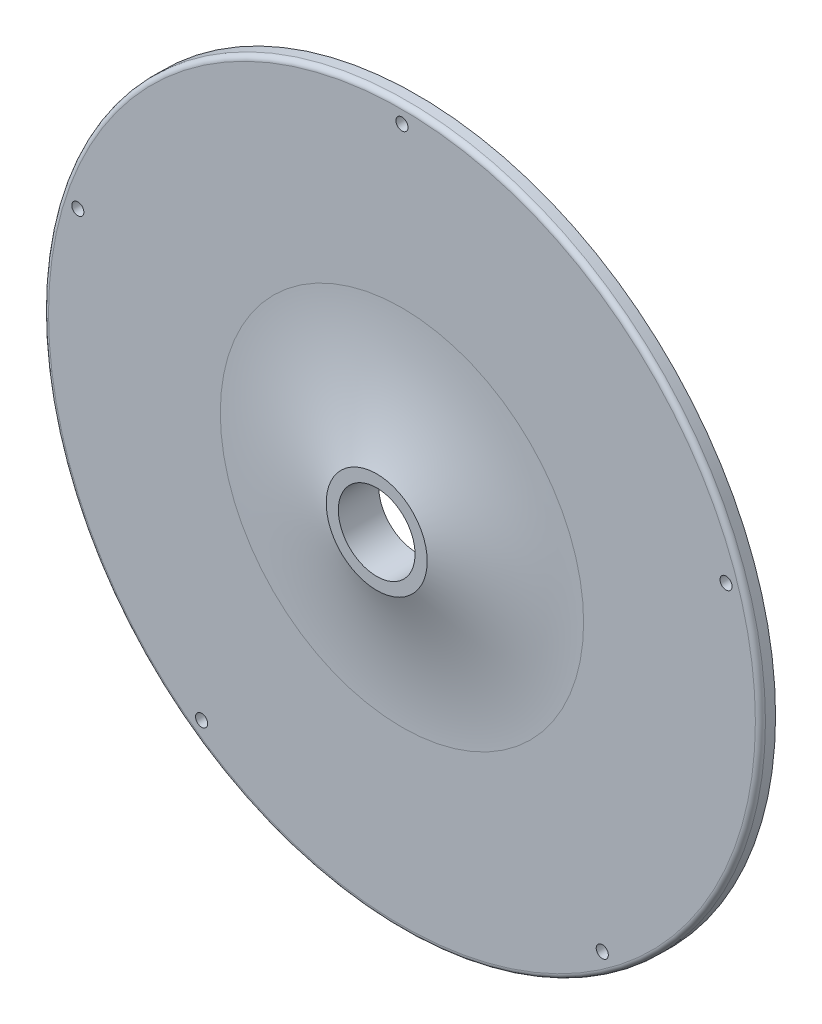
ISO-10303-21;
HEADER;
FILE_DESCRIPTION(('STEP AP214'),'2;1');
FILE_NAME('part.step','',(''),(''),'','','');
FILE_SCHEMA(('AUTOMOTIVE_DESIGN { 1 0 10303 214 1 1 1 1 }'));
ENDSEC;
DATA;
#1=APPLICATION_CONTEXT('core data for automotive mechanical design processes');
#2=APPLICATION_PROTOCOL_DEFINITION('international standard','automotive_design',2000,#1);
#3=PRODUCT_CONTEXT('',#1,'mechanical');
#4=PRODUCT('Part','Part','',(#3));
#5=PRODUCT_RELATED_PRODUCT_CATEGORY('part','',(#4));
#6=PRODUCT_DEFINITION_FORMATION('','',#4);
#7=PRODUCT_DEFINITION_CONTEXT('part definition',#1,'design');
#8=PRODUCT_DEFINITION('design','',#6,#7);
#9=PRODUCT_DEFINITION_SHAPE('','',#8);
#10=(LENGTH_UNIT() NAMED_UNIT(*) SI_UNIT(.MILLI.,.METRE.));
#11=(NAMED_UNIT(*) PLANE_ANGLE_UNIT() SI_UNIT($,.RADIAN.));
#12=(NAMED_UNIT(*) SI_UNIT($,.STERADIAN.) SOLID_ANGLE_UNIT());
#13=UNCERTAINTY_MEASURE_WITH_UNIT(LENGTH_MEASURE(1.E-05),#10,'distance_accuracy_value','');
#14=(GEOMETRIC_REPRESENTATION_CONTEXT(3) GLOBAL_UNCERTAINTY_ASSIGNED_CONTEXT((#13)) GLOBAL_UNIT_ASSIGNED_CONTEXT((#10,
#11,#12)) REPRESENTATION_CONTEXT('',''));
#15=CARTESIAN_POINT('',(0.,0.,0.));
#16=DIRECTION('',(0.,0.,1.));
#17=DIRECTION('',(1.,0.,0.));
#18=AXIS2_PLACEMENT_3D('',#15,#16,#17);
#19=CARTESIAN_POINT('',(0.,0.,-1.27));
#20=DIRECTION('',(0.,0.,1.));
#21=DIRECTION('',(1.,0.,0.));
#22=AXIS2_PLACEMENT_3D('',#19,#20,#21);
#23=CYLINDRICAL_SURFACE('',#22,81.28);
#24=CARTESIAN_POINT('',(0.,0.,-1.27));
#25=DIRECTION('',(0.,0.,1.));
#26=DIRECTION('',(1.,0.,0.));
#27=AXIS2_PLACEMENT_3D('',#24,#25,#26);
#28=CIRCLE('',#27,81.28);
#29=CARTESIAN_POINT('',(81.28,0.,-1.27));
#30=VERTEX_POINT('',#29);
#31=EDGE_CURVE('E49',#30,#30,#28,.T.);
#32=ORIENTED_EDGE('',*,*,#31,.T.);
#33=EDGE_LOOP('',(#32));
#34=FACE_BOUND('',#33,.T.);
#35=CARTESIAN_POINT('',(0.,0.,0.));
#36=DIRECTION('',(0.,0.,1.));
#37=DIRECTION('',(1.,0.,0.));
#38=AXIS2_PLACEMENT_3D('',#35,#36,#37);
#39=CIRCLE('',#38,81.28);
#40=CARTESIAN_POINT('',(81.28,0.,0.));
#41=VERTEX_POINT('',#40);
#42=EDGE_CURVE('E52',#41,#41,#39,.T.);
#43=ORIENTED_EDGE('',*,*,#42,.F.);
#44=EDGE_LOOP('',(#43));
#45=FACE_BOUND('',#44,.T.);
#46=ADVANCED_FACE('F34',(#34,#45),#23,.T.);
#47=CARTESIAN_POINT('',(0.,0.,-1.27));
#48=DIRECTION('',(0.,0.,1.));
#49=DIRECTION('',(1.,0.,0.));
#50=AXIS2_PLACEMENT_3D('',#47,#48,#49);
#51=PLANE('',#50);
#52=CARTESIAN_POINT('',(0.,0.,-1.27));
#53=DIRECTION('',(0.,0.,-1.));
#54=DIRECTION('',(-1.,0.,0.));
#55=AXIS2_PLACEMENT_3D('',#52,#53,#54);
#56=CIRCLE('',#55,13.97);
#57=CARTESIAN_POINT('',(-13.97,0.,-1.27));
#58=VERTEX_POINT('',#57);
#59=EDGE_CURVE('E94',#58,#58,#56,.T.);
#60=ORIENTED_EDGE('',*,*,#59,.F.);
#61=EDGE_LOOP('',(#60));
#62=FACE_BOUND('',#61,.T.);
#63=ORIENTED_EDGE('',*,*,#31,.F.);
#64=EDGE_LOOP('',(#63));
#65=FACE_BOUND('',#64,.T.);
#66=ADVANCED_FACE('F128',(#62,#65),#51,.F.);
#67=CARTESIAN_POINT('',(0.,0.,3.81));
#68=DIRECTION('',(0.,0.,-1.));
#69=DIRECTION('',(-1.,0.,0.));
#70=AXIS2_PLACEMENT_3D('',#67,#68,#69);
#71=CYLINDRICAL_SURFACE('',#70,90.17);
#72=CARTESIAN_POINT('',(0.,0.,2.54));
#73=DIRECTION('',(0.,0.,1.));
#74=DIRECTION('',(1.,0.,0.));
#75=AXIS2_PLACEMENT_3D('',#72,#73,#74);
#76=CIRCLE('',#75,90.17);
#77=CARTESIAN_POINT('',(-90.17,0.,2.54));
#78=VERTEX_POINT('',#77);
#79=EDGE_CURVE('E10',#78,#78,#76,.F.);
#80=CARTESIAN_POINT('',(0.,0.,0.));
#81=DIRECTION('',(0.,0.,1.));
#82=DIRECTION('',(1.,0.,0.));
#83=AXIS2_PLACEMENT_3D('',#80,#81,#82);
#84=CIRCLE('',#83,90.17);
#85=CARTESIAN_POINT('',(-90.17,0.,0.));
#86=VERTEX_POINT('',#85);
#87=EDGE_CURVE('E55',#86,#86,#84,.T.);
#88=CARTESIAN_POINT('',(-90.17,0.,2.54));
#89=CARTESIAN_POINT('',(-90.17,0.,2.51354166666667));
#90=CARTESIAN_POINT('',(-90.17,0.,2.48708333333333));
#91=CARTESIAN_POINT('',(-90.17,0.,2.43416666666667));
#92=CARTESIAN_POINT('',(-90.17,0.,2.40770833333333));
#93=CARTESIAN_POINT('',(-90.17,0.,2.35479166666667));
#94=CARTESIAN_POINT('',(-90.17,0.,2.32833333333333));
#95=CARTESIAN_POINT('',(-90.17,0.,2.27541666666667));
#96=CARTESIAN_POINT('',(-90.17,0.,2.24895833333333));
#97=CARTESIAN_POINT('',(-90.17,0.,2.19604166666667));
#98=CARTESIAN_POINT('',(-90.17,0.,2.16958333333333));
#99=CARTESIAN_POINT('',(-90.17,0.,2.11666666666667));
#100=CARTESIAN_POINT('',(-90.17,0.,2.09020833333333));
#101=CARTESIAN_POINT('',(-90.17,0.,2.03729166666667));
#102=CARTESIAN_POINT('',(-90.17,0.,2.01083333333333));
#103=CARTESIAN_POINT('',(-90.17,0.,1.95791666666667));
#104=CARTESIAN_POINT('',(-90.17,0.,1.93145833333333));
#105=CARTESIAN_POINT('',(-90.17,0.,1.87854166666667));
#106=CARTESIAN_POINT('',(-90.17,0.,1.85208333333333));
#107=CARTESIAN_POINT('',(-90.17,0.,1.79916666666667));
#108=CARTESIAN_POINT('',(-90.17,0.,1.77270833333333));
#109=CARTESIAN_POINT('',(-90.17,0.,1.71979166666667));
#110=CARTESIAN_POINT('',(-90.17,0.,1.69333333333333));
#111=CARTESIAN_POINT('',(-90.17,0.,1.64041666666667));
#112=CARTESIAN_POINT('',(-90.17,0.,1.61395833333333));
#113=CARTESIAN_POINT('',(-90.17,0.,1.56104166666667));
#114=CARTESIAN_POINT('',(-90.17,0.,1.53458333333333));
#115=CARTESIAN_POINT('',(-90.17,0.,1.48166666666667));
#116=CARTESIAN_POINT('',(-90.17,0.,1.45520833333333));
#117=CARTESIAN_POINT('',(-90.17,0.,1.40229166666667));
#118=CARTESIAN_POINT('',(-90.17,0.,1.37583333333333));
#119=CARTESIAN_POINT('',(-90.17,0.,1.32291666666667));
#120=CARTESIAN_POINT('',(-90.17,0.,1.29645833333333));
#121=CARTESIAN_POINT('',(-90.17,0.,1.24354166666667));
#122=CARTESIAN_POINT('',(-90.17,0.,1.21708333333333));
#123=CARTESIAN_POINT('',(-90.17,0.,1.16416666666667));
#124=CARTESIAN_POINT('',(-90.17,0.,1.13770833333333));
#125=CARTESIAN_POINT('',(-90.17,0.,1.08479166666667));
#126=CARTESIAN_POINT('',(-90.17,0.,1.05833333333333));
#127=CARTESIAN_POINT('',(-90.17,0.,1.00541666666667));
#128=CARTESIAN_POINT('',(-90.17,0.,0.978958333333333));
#129=CARTESIAN_POINT('',(-90.17,0.,0.926041666666666));
#130=CARTESIAN_POINT('',(-90.17,0.,0.899583333333333));
#131=CARTESIAN_POINT('',(-90.17,0.,0.846666666666667));
#132=CARTESIAN_POINT('',(-90.17,0.,0.820208333333333));
#133=CARTESIAN_POINT('',(-90.17,0.,0.767291666666667));
#134=CARTESIAN_POINT('',(-90.17,0.,0.740833333333333));
#135=CARTESIAN_POINT('',(-90.17,0.,0.687916666666667));
#136=CARTESIAN_POINT('',(-90.17,0.,0.661458333333333));
#137=CARTESIAN_POINT('',(-90.17,0.,0.608541666666667));
#138=CARTESIAN_POINT('',(-90.17,0.,0.582083333333333));
#139=CARTESIAN_POINT('',(-90.17,0.,0.529166666666667));
#140=CARTESIAN_POINT('',(-90.17,0.,0.502708333333333));
#141=CARTESIAN_POINT('',(-90.17,0.,0.449791666666667));
#142=CARTESIAN_POINT('',(-90.17,0.,0.423333333333333));
#143=CARTESIAN_POINT('',(-90.17,0.,0.370416666666667));
#144=CARTESIAN_POINT('',(-90.17,0.,0.343958333333333));
#145=CARTESIAN_POINT('',(-90.17,0.,0.291041666666667));
#146=CARTESIAN_POINT('',(-90.17,0.,0.264583333333333));
#147=CARTESIAN_POINT('',(-90.17,0.,0.211666666666667));
#148=CARTESIAN_POINT('',(-90.17,0.,0.185208333333333));
#149=CARTESIAN_POINT('',(-90.17,0.,0.132291666666667));
#150=CARTESIAN_POINT('',(-90.17,0.,0.105833333333333));
#151=CARTESIAN_POINT('',(-90.17,0.,0.0529166666666667));
#152=CARTESIAN_POINT('',(-90.17,0.,0.0264583333333333));
#153=CARTESIAN_POINT('',(-90.17,0.,0.));
#154=B_SPLINE_CURVE_WITH_KNOTS('',3,(#88,#89,#90,#91,#92,#93,#94,#95,#96,#97,#98,#99,#100,#101,
#102,#103,#104,#105,#106,#107,#108,#109,#110,#111,#112,#113,#114,#115,#116,#117,#118,#119,#120,
#121,#122,#123,#124,#125,#126,#127,#128,#129,#130,#131,#132,#133,#134,#135,#136,#137,#138,#139,
#140,#141,#142,#143,#144,#145,#146,#147,#148,#149,#150,#151,#152,#153),.UNSPECIFIED.,.F.,.F.,(4,
2,2,2,2,2,2,2,2,2,2,2,2,2,2,2,2,2,2,2,2,2,2,2,2,2,2,2,2,2,2,2,4),(0.,0.0793750000000004,0.15875,
0.238125,0.3175,0.396875000000001,0.47625,0.555625,0.635,0.714375,0.79375,0.873125,0.9525,
1.031875,1.11125,1.190625,1.27,1.349375,1.42875,1.508125,1.5875,1.666875,1.74625,1.825625,1.905,
1.984375,2.06375,2.143125,2.2225,2.301875,2.38125,2.460625,2.54),.UNSPECIFIED.);
#155=EDGE_CURVE('BSEAM131',#78,#86,#154,.T.);
#156=ORIENTED_EDGE('',*,*,#79,.T.);
#157=ORIENTED_EDGE('',*,*,#87,.T.);
#158=ORIENTED_EDGE('',*,*,#155,.T.);
#159=ORIENTED_EDGE('',*,*,#155,.F.);
#160=EDGE_LOOP('',(#156,#158,#157,#159));
#161=FACE_BOUND('',#160,.T.);
#162=ADVANCED_FACE('F131',(#161),#71,.T.);
#163=CARTESIAN_POINT('',(0.,0.,3.81));
#164=DIRECTION('',(0.,0.,1.));
#165=DIRECTION('',(1.,0.,0.));
#166=AXIS2_PLACEMENT_3D('',#163,#164,#165);
#167=PLANE('',#166);
#168=CARTESIAN_POINT('',(0.,0.,3.81));
#169=DIRECTION('',(0.,0.,1.));
#170=DIRECTION('',(1.,0.,0.));
#171=AXIS2_PLACEMENT_3D('',#168,#169,#170);
#172=CIRCLE('',#171,88.9);
#173=CARTESIAN_POINT('',(88.9,0.,3.81));
#174=VERTEX_POINT('',#173);
#175=EDGE_CURVE('E41',#174,#174,#172,.T.);
#176=ORIENTED_EDGE('',*,*,#175,.T.);
#177=EDGE_LOOP('',(#176));
#178=FACE_BOUND('',#177,.T.);
#179=CARTESIAN_POINT('',(0.,0.,3.80999999999999));
#180=DIRECTION('',(0.,0.,1.));
#181=DIRECTION('',(1.,0.,0.));
#182=AXIS2_PLACEMENT_3D('',#179,#180,#181);
#183=CIRCLE('',#182,45.6955678841871);
#184=CARTESIAN_POINT('',(45.6955678841871,0.,3.80999999999999));
#185=VERTEX_POINT('',#184);
#186=EDGE_CURVE('E45',#185,#185,#183,.F.);
#187=ORIENTED_EDGE('',*,*,#186,.T.);
#188=EDGE_LOOP('',(#187));
#189=FACE_BOUND('',#188,.T.);
#190=CARTESIAN_POINT('',(-81.5293198594021,26.4904818427921,3.81));
#191=DIRECTION('',(0.,0.,1.));
#192=DIRECTION('',(0.309016994374945,0.951056516295155,0.));
#193=AXIS2_PLACEMENT_3D('',#190,#191,#192);
#194=CIRCLE('',#193,1.524);
#195=CARTESIAN_POINT('',(-83.0533198594021,26.4904818427921,3.81));
#196=VERTEX_POINT('',#195);
#197=EDGE_CURVE('E64',#196,#196,#194,.T.);
#198=ORIENTED_EDGE('',*,*,#197,.F.);
#199=EDGE_LOOP('',(#198));
#200=FACE_BOUND('',#199,.T.);
#201=CARTESIAN_POINT('',(-50.3878907527719,-69.3529818427926,3.81));
#202=DIRECTION('',(0.,0.,1.));
#203=DIRECTION('',(-0.809016994374951,0.587785252292469,0.));
#204=AXIS2_PLACEMENT_3D('',#201,#202,#203);
#205=CIRCLE('',#204,1.524);
#206=CARTESIAN_POINT('',(-51.9118907527719,-69.3529818427926,3.81));
#207=VERTEX_POINT('',#206);
#208=EDGE_CURVE('E83',#207,#207,#205,.T.);
#209=ORIENTED_EDGE('',*,*,#208,.F.);
#210=EDGE_LOOP('',(#209));
#211=FACE_BOUND('',#210,.T.);
#212=CARTESIAN_POINT('',(50.3878907527729,-69.3529818427919,3.81));
#213=DIRECTION('',(0.,0.,1.));
#214=DIRECTION('',(-0.809016994374942,-0.58778525229248,0.));
#215=AXIS2_PLACEMENT_3D('',#212,#213,#214);
#216=CIRCLE('',#215,1.524);
#217=CARTESIAN_POINT('',(48.8638907527729,-69.3529818427919,3.81));
#218=VERTEX_POINT('',#217);
#219=EDGE_CURVE('E77',#218,#218,#216,.T.);
#220=ORIENTED_EDGE('',*,*,#219,.F.);
#221=EDGE_LOOP('',(#220));
#222=FACE_BOUND('',#221,.T.);
#223=CARTESIAN_POINT('',(81.5293198594017,26.4904818427933,3.81));
#224=DIRECTION('',(0.,0.,1.));
#225=DIRECTION('',(0.309016994374958,-0.95105651629515,0.));
#226=AXIS2_PLACEMENT_3D('',#223,#224,#225);
#227=CIRCLE('',#226,1.524);
#228=CARTESIAN_POINT('',(80.0053198594017,26.4904818427933,3.81));
#229=VERTEX_POINT('',#228);
#230=EDGE_CURVE('E70',#229,#229,#227,.T.);
#231=ORIENTED_EDGE('',*,*,#230,.F.);
#232=EDGE_LOOP('',(#231));
#233=FACE_BOUND('',#232,.T.);
#234=CARTESIAN_POINT('',(0.,85.725,3.81));
#235=DIRECTION('',(0.,0.,1.));
#236=DIRECTION('',(1.,0.,0.));
#237=AXIS2_PLACEMENT_3D('',#234,#235,#236);
#238=CIRCLE('',#237,1.524);
#239=CARTESIAN_POINT('',(-1.524,85.725,3.81));
#240=VERTEX_POINT('',#239);
#241=EDGE_CURVE('E60',#240,#240,#238,.T.);
#242=ORIENTED_EDGE('',*,*,#241,.F.);
#243=EDGE_LOOP('',(#242));
#244=FACE_BOUND('',#243,.T.);
#245=ADVANCED_FACE('F144',(#178,#189,#200,#211,#222,#233,#244),#167,.T.);
#246=CARTESIAN_POINT('',(0.,0.,0.));
#247=DIRECTION('',(0.,0.,1.));
#248=DIRECTION('',(1.,0.,0.));
#249=AXIS2_PLACEMENT_3D('',#246,#247,#248);
#250=PLANE('',#249);
#251=CARTESIAN_POINT('',(-81.5293198594021,26.4904818427921,0.));
#252=DIRECTION('',(0.,0.,1.));
#253=DIRECTION('',(0.309016994374945,0.951056516295155,0.));
#254=AXIS2_PLACEMENT_3D('',#251,#252,#253);
#255=CIRCLE('',#254,1.524);
#256=CARTESIAN_POINT('',(-83.0533198594021,26.4904818427921,0.));
#257=VERTEX_POINT('',#256);
#258=EDGE_CURVE('E86',#257,#257,#255,.T.);
#259=ORIENTED_EDGE('',*,*,#258,.T.);
#260=EDGE_LOOP('',(#259));
#261=FACE_BOUND('',#260,.T.);
#262=CARTESIAN_POINT('',(-50.3878907527719,-69.3529818427926,0.));
#263=DIRECTION('',(0.,0.,1.));
#264=DIRECTION('',(-0.809016994374951,0.587785252292469,0.));
#265=AXIS2_PLACEMENT_3D('',#262,#263,#264);
#266=CIRCLE('',#265,1.524);
#267=CARTESIAN_POINT('',(-51.9118907527719,-69.3529818427926,0.));
#268=VERTEX_POINT('',#267);
#269=EDGE_CURVE('E80',#268,#268,#266,.T.);
#270=ORIENTED_EDGE('',*,*,#269,.T.);
#271=EDGE_LOOP('',(#270));
#272=FACE_BOUND('',#271,.T.);
#273=CARTESIAN_POINT('',(50.3878907527729,-69.3529818427919,0.));
#274=DIRECTION('',(0.,0.,1.));
#275=DIRECTION('',(-0.809016994374942,-0.58778525229248,0.));
#276=AXIS2_PLACEMENT_3D('',#273,#274,#275);
#277=CIRCLE('',#276,1.524);
#278=CARTESIAN_POINT('',(48.8638907527729,-69.3529818427919,0.));
#279=VERTEX_POINT('',#278);
#280=EDGE_CURVE('E74',#279,#279,#277,.T.);
#281=ORIENTED_EDGE('',*,*,#280,.T.);
#282=EDGE_LOOP('',(#281));
#283=FACE_BOUND('',#282,.T.);
#284=CARTESIAN_POINT('',(81.5293198594017,26.4904818427933,0.));
#285=DIRECTION('',(0.,0.,1.));
#286=DIRECTION('',(0.309016994374958,-0.95105651629515,0.));
#287=AXIS2_PLACEMENT_3D('',#284,#285,#286);
#288=CIRCLE('',#287,1.524);
#289=CARTESIAN_POINT('',(80.0053198594017,26.4904818427933,0.));
#290=VERTEX_POINT('',#289);
#291=EDGE_CURVE('E67',#290,#290,#288,.T.);
#292=ORIENTED_EDGE('',*,*,#291,.T.);
#293=EDGE_LOOP('',(#292));
#294=FACE_BOUND('',#293,.T.);
#295=CARTESIAN_POINT('',(0.,85.725,0.));
#296=DIRECTION('',(0.,0.,1.));
#297=DIRECTION('',(1.,0.,0.));
#298=AXIS2_PLACEMENT_3D('',#295,#296,#297);
#299=CIRCLE('',#298,1.524);
#300=CARTESIAN_POINT('',(-1.524,85.725,0.));
#301=VERTEX_POINT('',#300);
#302=EDGE_CURVE('E61',#301,#301,#299,.T.);
#303=ORIENTED_EDGE('',*,*,#302,.T.);
#304=EDGE_LOOP('',(#303));
#305=FACE_BOUND('',#304,.T.);
#306=ORIENTED_EDGE('',*,*,#42,.T.);
#307=EDGE_LOOP('',(#306));
#308=FACE_BOUND('',#307,.T.);
#309=ORIENTED_EDGE('',*,*,#87,.F.);
#310=EDGE_LOOP('',(#309));
#311=FACE_BOUND('',#310,.T.);
#312=ADVANCED_FACE('F140',(#261,#272,#283,#294,#305,#308,#311),#250,.F.);
#313=CARTESIAN_POINT('',(0.,85.725,3.81));
#314=DIRECTION('',(0.,0.,-1.));
#315=DIRECTION('',(-1.,0.,0.));
#316=AXIS2_PLACEMENT_3D('',#313,#314,#315);
#317=CYLINDRICAL_SURFACE('',#316,1.524);
#318=CARTESIAN_POINT('',(-1.524,85.725,3.81));
#319=CARTESIAN_POINT('',(-1.524,85.725,3.7703125));
#320=CARTESIAN_POINT('',(-1.524,85.725,3.730625));
#321=CARTESIAN_POINT('',(-1.524,85.725,3.65125));
#322=CARTESIAN_POINT('',(-1.524,85.725,3.6115625));
#323=CARTESIAN_POINT('',(-1.524,85.725,3.5321875));
#324=CARTESIAN_POINT('',(-1.524,85.725,3.4925));
#325=CARTESIAN_POINT('',(-1.524,85.725,3.413125));
#326=CARTESIAN_POINT('',(-1.524,85.725,3.3734375));
#327=CARTESIAN_POINT('',(-1.524,85.725,3.2940625));
#328=CARTESIAN_POINT('',(-1.524,85.725,3.254375));
#329=CARTESIAN_POINT('',(-1.524,85.725,3.175));
#330=CARTESIAN_POINT('',(-1.524,85.725,3.1353125));
#331=CARTESIAN_POINT('',(-1.524,85.725,3.0559375));
#332=CARTESIAN_POINT('',(-1.524,85.725,3.01625));
#333=CARTESIAN_POINT('',(-1.524,85.725,2.936875));
#334=CARTESIAN_POINT('',(-1.524,85.725,2.8971875));
#335=CARTESIAN_POINT('',(-1.524,85.725,2.8178125));
#336=CARTESIAN_POINT('',(-1.524,85.725,2.778125));
#337=CARTESIAN_POINT('',(-1.524,85.725,2.69875));
#338=CARTESIAN_POINT('',(-1.524,85.725,2.6590625));
#339=CARTESIAN_POINT('',(-1.524,85.725,2.5796875));
#340=CARTESIAN_POINT('',(-1.524,85.725,2.54));
#341=CARTESIAN_POINT('',(-1.524,85.725,2.460625));
#342=CARTESIAN_POINT('',(-1.524,85.725,2.4209375));
#343=CARTESIAN_POINT('',(-1.524,85.725,2.3415625));
#344=CARTESIAN_POINT('',(-1.524,85.725,2.301875));
#345=CARTESIAN_POINT('',(-1.524,85.725,2.2225));
#346=CARTESIAN_POINT('',(-1.524,85.725,2.1828125));
#347=CARTESIAN_POINT('',(-1.524,85.725,2.1034375));
#348=CARTESIAN_POINT('',(-1.524,85.725,2.06375));
#349=CARTESIAN_POINT('',(-1.524,85.725,1.984375));
#350=CARTESIAN_POINT('',(-1.524,85.725,1.9446875));
#351=CARTESIAN_POINT('',(-1.524,85.725,1.8653125));
#352=CARTESIAN_POINT('',(-1.524,85.725,1.825625));
#353=CARTESIAN_POINT('',(-1.524,85.725,1.74625));
#354=CARTESIAN_POINT('',(-1.524,85.725,1.7065625));
#355=CARTESIAN_POINT('',(-1.524,85.725,1.6271875));
#356=CARTESIAN_POINT('',(-1.524,85.725,1.5875));
#357=CARTESIAN_POINT('',(-1.524,85.725,1.508125));
#358=CARTESIAN_POINT('',(-1.524,85.725,1.4684375));
#359=CARTESIAN_POINT('',(-1.524,85.725,1.3890625));
#360=CARTESIAN_POINT('',(-1.524,85.725,1.349375));
#361=CARTESIAN_POINT('',(-1.524,85.725,1.27));
#362=CARTESIAN_POINT('',(-1.524,85.725,1.2303125));
#363=CARTESIAN_POINT('',(-1.524,85.725,1.1509375));
#364=CARTESIAN_POINT('',(-1.524,85.725,1.11125));
#365=CARTESIAN_POINT('',(-1.524,85.725,1.031875));
#366=CARTESIAN_POINT('',(-1.524,85.725,0.9921875));
#367=CARTESIAN_POINT('',(-1.524,85.725,0.9128125));
#368=CARTESIAN_POINT('',(-1.524,85.725,0.873125));
#369=CARTESIAN_POINT('',(-1.524,85.725,0.79375));
#370=CARTESIAN_POINT('',(-1.524,85.725,0.7540625));
#371=CARTESIAN_POINT('',(-1.524,85.725,0.6746875));
#372=CARTESIAN_POINT('',(-1.524,85.725,0.635));
#373=CARTESIAN_POINT('',(-1.524,85.725,0.555625));
#374=CARTESIAN_POINT('',(-1.524,85.725,0.5159375));
#375=CARTESIAN_POINT('',(-1.524,85.725,0.4365625));
#376=CARTESIAN_POINT('',(-1.524,85.725,0.396875));
#377=CARTESIAN_POINT('',(-1.524,85.725,0.3175));
#378=CARTESIAN_POINT('',(-1.524,85.725,0.2778125));
#379=CARTESIAN_POINT('',(-1.524,85.725,0.1984375));
#380=CARTESIAN_POINT('',(-1.524,85.725,0.15875));
#381=CARTESIAN_POINT('',(-1.524,85.725,0.0793749999999999));
#382=CARTESIAN_POINT('',(-1.524,85.725,0.0396874999999999));
#383=CARTESIAN_POINT('',(-1.524,85.725,0.));
#384=B_SPLINE_CURVE_WITH_KNOTS('',3,(#318,#319,#320,#321,#322,#323,#324,#325,#326,#327,#328,
#329,#330,#331,#332,#333,#334,#335,#336,#337,#338,#339,#340,#341,#342,#343,#344,#345,#346,#347,
#348,#349,#350,#351,#352,#353,#354,#355,#356,#357,#358,#359,#360,#361,#362,#363,#364,#365,#366,
#367,#368,#369,#370,#371,#372,#373,#374,#375,#376,#377,#378,#379,#380,#381,#382,#383),
.UNSPECIFIED.,.F.,.F.,(4,2,2,2,2,2,2,2,2,2,2,2,2,2,2,2,2,2,2,2,2,2,2,2,2,2,2,2,2,2,2,2,4),(0.,
0.1190625,0.238125,0.3571875,0.47625,0.5953125,0.714375,0.8334375,0.9525,1.0715625,1.190625,
1.3096875,1.42875,1.5478125,1.666875,1.7859375,1.905,2.0240625,2.143125,2.2621875,2.38125,
2.5003125,2.619375,2.7384375,2.8575,2.9765625,3.095625,3.2146875,3.33375,3.4528125,3.571875,
3.6909375,3.81),.UNSPECIFIED.);
#385=EDGE_CURVE('BSEAM143',#240,#301,#384,.T.);
#386=ORIENTED_EDGE('',*,*,#241,.T.);
#387=ORIENTED_EDGE('',*,*,#302,.F.);
#388=ORIENTED_EDGE('',*,*,#385,.T.);
#389=ORIENTED_EDGE('',*,*,#385,.F.);
#390=EDGE_LOOP('',(#386,#388,#387,#389));
#391=FACE_BOUND('',#390,.T.);
#392=ADVANCED_FACE('F143',(#391),#317,.F.);
#393=CARTESIAN_POINT('',(81.5293198594017,26.4904818427933,3.81));
#394=DIRECTION('',(0.,0.,-1.));
#395=DIRECTION('',(-1.,0.,0.));
#396=AXIS2_PLACEMENT_3D('',#393,#394,#395);
#397=CYLINDRICAL_SURFACE('',#396,1.524);
#398=CARTESIAN_POINT('',(80.0053198594017,26.4904818427933,3.81));
#399=CARTESIAN_POINT('',(80.0053198594017,26.4904818427933,3.7703125));
#400=CARTESIAN_POINT('',(80.0053198594017,26.4904818427933,3.730625));
#401=CARTESIAN_POINT('',(80.0053198594017,26.4904818427933,3.65125));
#402=CARTESIAN_POINT('',(80.0053198594017,26.4904818427933,3.6115625));
#403=CARTESIAN_POINT('',(80.0053198594017,26.4904818427933,3.5321875));
#404=CARTESIAN_POINT('',(80.0053198594017,26.4904818427933,3.4925));
#405=CARTESIAN_POINT('',(80.0053198594017,26.4904818427933,3.413125));
#406=CARTESIAN_POINT('',(80.0053198594017,26.4904818427933,3.3734375));
#407=CARTESIAN_POINT('',(80.0053198594017,26.4904818427933,3.2940625));
#408=CARTESIAN_POINT('',(80.0053198594017,26.4904818427933,3.254375));
#409=CARTESIAN_POINT('',(80.0053198594017,26.4904818427933,3.175));
#410=CARTESIAN_POINT('',(80.0053198594017,26.4904818427933,3.1353125));
#411=CARTESIAN_POINT('',(80.0053198594017,26.4904818427933,3.0559375));
#412=CARTESIAN_POINT('',(80.0053198594017,26.4904818427933,3.01625));
#413=CARTESIAN_POINT('',(80.0053198594017,26.4904818427933,2.936875));
#414=CARTESIAN_POINT('',(80.0053198594017,26.4904818427933,2.8971875));
#415=CARTESIAN_POINT('',(80.0053198594017,26.4904818427933,2.8178125));
#416=CARTESIAN_POINT('',(80.0053198594017,26.4904818427933,2.778125));
#417=CARTESIAN_POINT('',(80.0053198594017,26.4904818427933,2.69875));
#418=CARTESIAN_POINT('',(80.0053198594017,26.4904818427933,2.6590625));
#419=CARTESIAN_POINT('',(80.0053198594017,26.4904818427933,2.5796875));
#420=CARTESIAN_POINT('',(80.0053198594017,26.4904818427933,2.54));
#421=CARTESIAN_POINT('',(80.0053198594017,26.4904818427933,2.460625));
#422=CARTESIAN_POINT('',(80.0053198594017,26.4904818427933,2.4209375));
#423=CARTESIAN_POINT('',(80.0053198594017,26.4904818427933,2.3415625));
#424=CARTESIAN_POINT('',(80.0053198594017,26.4904818427933,2.301875));
#425=CARTESIAN_POINT('',(80.0053198594017,26.4904818427933,2.2225));
#426=CARTESIAN_POINT('',(80.0053198594017,26.4904818427933,2.1828125));
#427=CARTESIAN_POINT('',(80.0053198594017,26.4904818427933,2.1034375));
#428=CARTESIAN_POINT('',(80.0053198594017,26.4904818427933,2.06375));
#429=CARTESIAN_POINT('',(80.0053198594017,26.4904818427933,1.984375));
#430=CARTESIAN_POINT('',(80.0053198594017,26.4904818427933,1.9446875));
#431=CARTESIAN_POINT('',(80.0053198594017,26.4904818427933,1.8653125));
#432=CARTESIAN_POINT('',(80.0053198594017,26.4904818427933,1.825625));
#433=CARTESIAN_POINT('',(80.0053198594017,26.4904818427933,1.74625));
#434=CARTESIAN_POINT('',(80.0053198594017,26.4904818427933,1.7065625));
#435=CARTESIAN_POINT('',(80.0053198594017,26.4904818427933,1.6271875));
#436=CARTESIAN_POINT('',(80.0053198594017,26.4904818427933,1.5875));
#437=CARTESIAN_POINT('',(80.0053198594017,26.4904818427933,1.508125));
#438=CARTESIAN_POINT('',(80.0053198594017,26.4904818427933,1.4684375));
#439=CARTESIAN_POINT('',(80.0053198594017,26.4904818427933,1.3890625));
#440=CARTESIAN_POINT('',(80.0053198594017,26.4904818427933,1.349375));
#441=CARTESIAN_POINT('',(80.0053198594017,26.4904818427933,1.27));
#442=CARTESIAN_POINT('',(80.0053198594017,26.4904818427933,1.2303125));
#443=CARTESIAN_POINT('',(80.0053198594017,26.4904818427933,1.1509375));
#444=CARTESIAN_POINT('',(80.0053198594017,26.4904818427933,1.11125));
#445=CARTESIAN_POINT('',(80.0053198594017,26.4904818427933,1.031875));
#446=CARTESIAN_POINT('',(80.0053198594017,26.4904818427933,0.9921875));
#447=CARTESIAN_POINT('',(80.0053198594017,26.4904818427933,0.9128125));
#448=CARTESIAN_POINT('',(80.0053198594017,26.4904818427933,0.873125));
#449=CARTESIAN_POINT('',(80.0053198594017,26.4904818427933,0.79375));
#450=CARTESIAN_POINT('',(80.0053198594017,26.4904818427933,0.7540625));
#451=CARTESIAN_POINT('',(80.0053198594017,26.4904818427933,0.6746875));
#452=CARTESIAN_POINT('',(80.0053198594017,26.4904818427933,0.635));
#453=CARTESIAN_POINT('',(80.0053198594017,26.4904818427933,0.555625));
#454=CARTESIAN_POINT('',(80.0053198594017,26.4904818427933,0.5159375));
#455=CARTESIAN_POINT('',(80.0053198594017,26.4904818427933,0.4365625));
#456=CARTESIAN_POINT('',(80.0053198594017,26.4904818427933,0.396875));
#457=CARTESIAN_POINT('',(80.0053198594017,26.4904818427933,0.3175));
#458=CARTESIAN_POINT('',(80.0053198594017,26.4904818427933,0.2778125));
#459=CARTESIAN_POINT('',(80.0053198594017,26.4904818427933,0.1984375));
#460=CARTESIAN_POINT('',(80.0053198594017,26.4904818427933,0.15875));
#461=CARTESIAN_POINT('',(80.0053198594017,26.4904818427933,0.0793749999999999));
#462=CARTESIAN_POINT('',(80.0053198594017,26.4904818427933,0.0396874999999999));
#463=CARTESIAN_POINT('',(80.0053198594017,26.4904818427933,0.));
#464=B_SPLINE_CURVE_WITH_KNOTS('',3,(#398,#399,#400,#401,#402,#403,#404,#405,#406,#407,#408,
#409,#410,#411,#412,#413,#414,#415,#416,#417,#418,#419,#420,#421,#422,#423,#424,#425,#426,#427,
#428,#429,#430,#431,#432,#433,#434,#435,#436,#437,#438,#439,#440,#441,#442,#443,#444,#445,#446,
#447,#448,#449,#450,#451,#452,#453,#454,#455,#456,#457,#458,#459,#460,#461,#462,#463),
.UNSPECIFIED.,.F.,.F.,(4,2,2,2,2,2,2,2,2,2,2,2,2,2,2,2,2,2,2,2,2,2,2,2,2,2,2,2,2,2,2,2,4),(0.,
0.1190625,0.238125,0.3571875,0.47625,0.5953125,0.714375,0.8334375,0.9525,1.0715625,1.190625,
1.3096875,1.42875,1.5478125,1.666875,1.7859375,1.905,2.0240625,2.143125,2.2621875,2.38125,
2.5003125,2.619375,2.7384375,2.8575,2.9765625,3.095625,3.2146875,3.33375,3.4528125,3.571875,
3.6909375,3.81),.UNSPECIFIED.);
#465=EDGE_CURVE('BSEAM180',#229,#290,#464,.T.);
#466=ORIENTED_EDGE('',*,*,#230,.T.);
#467=ORIENTED_EDGE('',*,*,#291,.F.);
#468=ORIENTED_EDGE('',*,*,#465,.T.);
#469=ORIENTED_EDGE('',*,*,#465,.F.);
#470=EDGE_LOOP('',(#466,#468,#467,#469));
#471=FACE_BOUND('',#470,.T.);
#472=ADVANCED_FACE('F180',(#471),#397,.F.);
#473=CARTESIAN_POINT('',(50.3878907527729,-69.3529818427919,3.81));
#474=DIRECTION('',(0.,0.,-1.));
#475=DIRECTION('',(-1.,0.,0.));
#476=AXIS2_PLACEMENT_3D('',#473,#474,#475);
#477=CYLINDRICAL_SURFACE('',#476,1.524);
#478=CARTESIAN_POINT('',(48.8638907527729,-69.3529818427919,3.81));
#479=CARTESIAN_POINT('',(48.8638907527729,-69.3529818427919,3.7703125));
#480=CARTESIAN_POINT('',(48.8638907527729,-69.3529818427919,3.730625));
#481=CARTESIAN_POINT('',(48.8638907527729,-69.3529818427919,3.65125));
#482=CARTESIAN_POINT('',(48.8638907527729,-69.3529818427919,3.6115625));
#483=CARTESIAN_POINT('',(48.8638907527729,-69.3529818427919,3.5321875));
#484=CARTESIAN_POINT('',(48.8638907527729,-69.3529818427919,3.4925));
#485=CARTESIAN_POINT('',(48.8638907527729,-69.3529818427919,3.413125));
#486=CARTESIAN_POINT('',(48.8638907527729,-69.3529818427919,3.3734375));
#487=CARTESIAN_POINT('',(48.8638907527729,-69.3529818427919,3.2940625));
#488=CARTESIAN_POINT('',(48.8638907527729,-69.3529818427919,3.254375));
#489=CARTESIAN_POINT('',(48.8638907527729,-69.3529818427919,3.175));
#490=CARTESIAN_POINT('',(48.8638907527729,-69.3529818427919,3.1353125));
#491=CARTESIAN_POINT('',(48.8638907527729,-69.3529818427919,3.0559375));
#492=CARTESIAN_POINT('',(48.8638907527729,-69.3529818427919,3.01625));
#493=CARTESIAN_POINT('',(48.8638907527729,-69.3529818427919,2.936875));
#494=CARTESIAN_POINT('',(48.8638907527729,-69.3529818427919,2.8971875));
#495=CARTESIAN_POINT('',(48.8638907527729,-69.3529818427919,2.8178125));
#496=CARTESIAN_POINT('',(48.8638907527729,-69.3529818427919,2.778125));
#497=CARTESIAN_POINT('',(48.8638907527729,-69.3529818427919,2.69875));
#498=CARTESIAN_POINT('',(48.8638907527729,-69.3529818427919,2.6590625));
#499=CARTESIAN_POINT('',(48.8638907527729,-69.3529818427919,2.5796875));
#500=CARTESIAN_POINT('',(48.8638907527729,-69.3529818427919,2.54));
#501=CARTESIAN_POINT('',(48.8638907527729,-69.3529818427919,2.460625));
#502=CARTESIAN_POINT('',(48.8638907527729,-69.3529818427919,2.4209375));
#503=CARTESIAN_POINT('',(48.8638907527729,-69.3529818427919,2.3415625));
#504=CARTESIAN_POINT('',(48.8638907527729,-69.3529818427919,2.301875));
#505=CARTESIAN_POINT('',(48.8638907527729,-69.3529818427919,2.2225));
#506=CARTESIAN_POINT('',(48.8638907527729,-69.3529818427919,2.1828125));
#507=CARTESIAN_POINT('',(48.8638907527729,-69.3529818427919,2.1034375));
#508=CARTESIAN_POINT('',(48.8638907527729,-69.3529818427919,2.06375));
#509=CARTESIAN_POINT('',(48.8638907527729,-69.3529818427919,1.984375));
#510=CARTESIAN_POINT('',(48.8638907527729,-69.3529818427919,1.9446875));
#511=CARTESIAN_POINT('',(48.8638907527729,-69.3529818427919,1.8653125));
#512=CARTESIAN_POINT('',(48.8638907527729,-69.3529818427919,1.825625));
#513=CARTESIAN_POINT('',(48.8638907527729,-69.3529818427919,1.74625));
#514=CARTESIAN_POINT('',(48.8638907527729,-69.3529818427919,1.7065625));
#515=CARTESIAN_POINT('',(48.8638907527729,-69.3529818427919,1.6271875));
#516=CARTESIAN_POINT('',(48.8638907527729,-69.3529818427919,1.5875));
#517=CARTESIAN_POINT('',(48.8638907527729,-69.3529818427919,1.508125));
#518=CARTESIAN_POINT('',(48.8638907527729,-69.3529818427919,1.4684375));
#519=CARTESIAN_POINT('',(48.8638907527729,-69.3529818427919,1.3890625));
#520=CARTESIAN_POINT('',(48.8638907527729,-69.3529818427919,1.349375));
#521=CARTESIAN_POINT('',(48.8638907527729,-69.3529818427919,1.27));
#522=CARTESIAN_POINT('',(48.8638907527729,-69.3529818427919,1.2303125));
#523=CARTESIAN_POINT('',(48.8638907527729,-69.3529818427919,1.1509375));
#524=CARTESIAN_POINT('',(48.8638907527729,-69.3529818427919,1.11125));
#525=CARTESIAN_POINT('',(48.8638907527729,-69.3529818427919,1.031875));
#526=CARTESIAN_POINT('',(48.8638907527729,-69.3529818427919,0.9921875));
#527=CARTESIAN_POINT('',(48.8638907527729,-69.3529818427919,0.9128125));
#528=CARTESIAN_POINT('',(48.8638907527729,-69.3529818427919,0.873125));
#529=CARTESIAN_POINT('',(48.8638907527729,-69.3529818427919,0.79375));
#530=CARTESIAN_POINT('',(48.8638907527729,-69.3529818427919,0.7540625));
#531=CARTESIAN_POINT('',(48.8638907527729,-69.3529818427919,0.6746875));
#532=CARTESIAN_POINT('',(48.8638907527729,-69.3529818427919,0.635));
#533=CARTESIAN_POINT('',(48.8638907527729,-69.3529818427919,0.555625));
#534=CARTESIAN_POINT('',(48.8638907527729,-69.3529818427919,0.5159375));
#535=CARTESIAN_POINT('',(48.8638907527729,-69.3529818427919,0.4365625));
#536=CARTESIAN_POINT('',(48.8638907527729,-69.3529818427919,0.396875));
#537=CARTESIAN_POINT('',(48.8638907527729,-69.3529818427919,0.3175));
#538=CARTESIAN_POINT('',(48.8638907527729,-69.3529818427919,0.2778125));
#539=CARTESIAN_POINT('',(48.8638907527729,-69.3529818427919,0.1984375));
#540=CARTESIAN_POINT('',(48.8638907527729,-69.3529818427919,0.15875));
#541=CARTESIAN_POINT('',(48.8638907527729,-69.3529818427919,0.0793749999999999));
#542=CARTESIAN_POINT('',(48.8638907527729,-69.3529818427919,0.0396874999999999));
#543=CARTESIAN_POINT('',(48.8638907527729,-69.3529818427919,0.));
#544=B_SPLINE_CURVE_WITH_KNOTS('',3,(#478,#479,#480,#481,#482,#483,#484,#485,#486,#487,#488,
#489,#490,#491,#492,#493,#494,#495,#496,#497,#498,#499,#500,#501,#502,#503,#504,#505,#506,#507,
#508,#509,#510,#511,#512,#513,#514,#515,#516,#517,#518,#519,#520,#521,#522,#523,#524,#525,#526,
#527,#528,#529,#530,#531,#532,#533,#534,#535,#536,#537,#538,#539,#540,#541,#542,#543),
.UNSPECIFIED.,.F.,.F.,(4,2,2,2,2,2,2,2,2,2,2,2,2,2,2,2,2,2,2,2,2,2,2,2,2,2,2,2,2,2,2,2,4),(0.,
0.1190625,0.238125,0.3571875,0.47625,0.5953125,0.714375,0.8334375,0.9525,1.0715625,1.190625,
1.3096875,1.42875,1.5478125,1.666875,1.7859375,1.905,2.0240625,2.143125,2.2621875,2.38125,
2.5003125,2.619375,2.7384375,2.8575,2.9765625,3.095625,3.2146875,3.33375,3.4528125,3.571875,
3.6909375,3.81),.UNSPECIFIED.);
#545=EDGE_CURVE('BSEAM176',#218,#279,#544,.T.);
#546=ORIENTED_EDGE('',*,*,#219,.T.);
#547=ORIENTED_EDGE('',*,*,#280,.F.);
#548=ORIENTED_EDGE('',*,*,#545,.T.);
#549=ORIENTED_EDGE('',*,*,#545,.F.);
#550=EDGE_LOOP('',(#546,#548,#547,#549));
#551=FACE_BOUND('',#550,.T.);
#552=ADVANCED_FACE('F176',(#551),#477,.F.);
#553=CARTESIAN_POINT('',(-50.3878907527719,-69.3529818427926,3.81));
#554=DIRECTION('',(0.,0.,-1.));
#555=DIRECTION('',(-1.,0.,0.));
#556=AXIS2_PLACEMENT_3D('',#553,#554,#555);
#557=CYLINDRICAL_SURFACE('',#556,1.524);
#558=CARTESIAN_POINT('',(-51.9118907527719,-69.3529818427926,3.81));
#559=CARTESIAN_POINT('',(-51.9118907527719,-69.3529818427926,3.7703125));
#560=CARTESIAN_POINT('',(-51.9118907527719,-69.3529818427926,3.730625));
#561=CARTESIAN_POINT('',(-51.9118907527719,-69.3529818427926,3.65125));
#562=CARTESIAN_POINT('',(-51.9118907527719,-69.3529818427926,3.6115625));
#563=CARTESIAN_POINT('',(-51.9118907527719,-69.3529818427926,3.5321875));
#564=CARTESIAN_POINT('',(-51.9118907527719,-69.3529818427926,3.4925));
#565=CARTESIAN_POINT('',(-51.9118907527719,-69.3529818427926,3.413125));
#566=CARTESIAN_POINT('',(-51.9118907527719,-69.3529818427926,3.3734375));
#567=CARTESIAN_POINT('',(-51.9118907527719,-69.3529818427926,3.2940625));
#568=CARTESIAN_POINT('',(-51.9118907527719,-69.3529818427926,3.254375));
#569=CARTESIAN_POINT('',(-51.9118907527719,-69.3529818427926,3.175));
#570=CARTESIAN_POINT('',(-51.9118907527719,-69.3529818427926,3.1353125));
#571=CARTESIAN_POINT('',(-51.9118907527719,-69.3529818427926,3.0559375));
#572=CARTESIAN_POINT('',(-51.9118907527719,-69.3529818427926,3.01625));
#573=CARTESIAN_POINT('',(-51.9118907527719,-69.3529818427926,2.936875));
#574=CARTESIAN_POINT('',(-51.9118907527719,-69.3529818427926,2.8971875));
#575=CARTESIAN_POINT('',(-51.9118907527719,-69.3529818427926,2.8178125));
#576=CARTESIAN_POINT('',(-51.9118907527719,-69.3529818427926,2.778125));
#577=CARTESIAN_POINT('',(-51.9118907527719,-69.3529818427926,2.69875));
#578=CARTESIAN_POINT('',(-51.9118907527719,-69.3529818427926,2.6590625));
#579=CARTESIAN_POINT('',(-51.9118907527719,-69.3529818427926,2.5796875));
#580=CARTESIAN_POINT('',(-51.9118907527719,-69.3529818427926,2.54));
#581=CARTESIAN_POINT('',(-51.9118907527719,-69.3529818427926,2.460625));
#582=CARTESIAN_POINT('',(-51.9118907527719,-69.3529818427926,2.4209375));
#583=CARTESIAN_POINT('',(-51.9118907527719,-69.3529818427926,2.3415625));
#584=CARTESIAN_POINT('',(-51.9118907527719,-69.3529818427926,2.301875));
#585=CARTESIAN_POINT('',(-51.9118907527719,-69.3529818427926,2.2225));
#586=CARTESIAN_POINT('',(-51.9118907527719,-69.3529818427926,2.1828125));
#587=CARTESIAN_POINT('',(-51.9118907527719,-69.3529818427926,2.1034375));
#588=CARTESIAN_POINT('',(-51.9118907527719,-69.3529818427926,2.06375));
#589=CARTESIAN_POINT('',(-51.9118907527719,-69.3529818427926,1.984375));
#590=CARTESIAN_POINT('',(-51.9118907527719,-69.3529818427926,1.9446875));
#591=CARTESIAN_POINT('',(-51.9118907527719,-69.3529818427926,1.8653125));
#592=CARTESIAN_POINT('',(-51.9118907527719,-69.3529818427926,1.825625));
#593=CARTESIAN_POINT('',(-51.9118907527719,-69.3529818427926,1.74625));
#594=CARTESIAN_POINT('',(-51.9118907527719,-69.3529818427926,1.7065625));
#595=CARTESIAN_POINT('',(-51.9118907527719,-69.3529818427926,1.6271875));
#596=CARTESIAN_POINT('',(-51.9118907527719,-69.3529818427926,1.5875));
#597=CARTESIAN_POINT('',(-51.9118907527719,-69.3529818427926,1.508125));
#598=CARTESIAN_POINT('',(-51.9118907527719,-69.3529818427926,1.4684375));
#599=CARTESIAN_POINT('',(-51.9118907527719,-69.3529818427926,1.3890625));
#600=CARTESIAN_POINT('',(-51.9118907527719,-69.3529818427926,1.349375));
#601=CARTESIAN_POINT('',(-51.9118907527719,-69.3529818427926,1.27));
#602=CARTESIAN_POINT('',(-51.9118907527719,-69.3529818427926,1.2303125));
#603=CARTESIAN_POINT('',(-51.9118907527719,-69.3529818427926,1.1509375));
#604=CARTESIAN_POINT('',(-51.9118907527719,-69.3529818427926,1.11125));
#605=CARTESIAN_POINT('',(-51.9118907527719,-69.3529818427926,1.031875));
#606=CARTESIAN_POINT('',(-51.9118907527719,-69.3529818427926,0.9921875));
#607=CARTESIAN_POINT('',(-51.9118907527719,-69.3529818427926,0.9128125));
#608=CARTESIAN_POINT('',(-51.9118907527719,-69.3529818427926,0.873125));
#609=CARTESIAN_POINT('',(-51.9118907527719,-69.3529818427926,0.79375));
#610=CARTESIAN_POINT('',(-51.9118907527719,-69.3529818427926,0.7540625));
#611=CARTESIAN_POINT('',(-51.9118907527719,-69.3529818427926,0.6746875));
#612=CARTESIAN_POINT('',(-51.9118907527719,-69.3529818427926,0.635));
#613=CARTESIAN_POINT('',(-51.9118907527719,-69.3529818427926,0.555625));
#614=CARTESIAN_POINT('',(-51.9118907527719,-69.3529818427926,0.5159375));
#615=CARTESIAN_POINT('',(-51.9118907527719,-69.3529818427926,0.4365625));
#616=CARTESIAN_POINT('',(-51.9118907527719,-69.3529818427926,0.396875));
#617=CARTESIAN_POINT('',(-51.9118907527719,-69.3529818427926,0.3175));
#618=CARTESIAN_POINT('',(-51.9118907527719,-69.3529818427926,0.2778125));
#619=CARTESIAN_POINT('',(-51.9118907527719,-69.3529818427926,0.1984375));
#620=CARTESIAN_POINT('',(-51.9118907527719,-69.3529818427926,0.15875));
#621=CARTESIAN_POINT('',(-51.9118907527719,-69.3529818427926,0.0793749999999999));
#622=CARTESIAN_POINT('',(-51.9118907527719,-69.3529818427926,0.0396874999999999));
#623=CARTESIAN_POINT('',(-51.9118907527719,-69.3529818427926,0.));
#624=B_SPLINE_CURVE_WITH_KNOTS('',3,(#558,#559,#560,#561,#562,#563,#564,#565,#566,#567,#568,
#569,#570,#571,#572,#573,#574,#575,#576,#577,#578,#579,#580,#581,#582,#583,#584,#585,#586,#587,
#588,#589,#590,#591,#592,#593,#594,#595,#596,#597,#598,#599,#600,#601,#602,#603,#604,#605,#606,
#607,#608,#609,#610,#611,#612,#613,#614,#615,#616,#617,#618,#619,#620,#621,#622,#623),
.UNSPECIFIED.,.F.,.F.,(4,2,2,2,2,2,2,2,2,2,2,2,2,2,2,2,2,2,2,2,2,2,2,2,2,2,2,2,2,2,2,2,4),(0.,
0.1190625,0.238125,0.3571875,0.47625,0.5953125,0.714375,0.8334375,0.9525,1.0715625,1.190625,
1.3096875,1.42875,1.5478125,1.666875,1.7859375,1.905,2.0240625,2.143125,2.2621875,2.38125,
2.5003125,2.619375,2.7384375,2.8575,2.9765625,3.095625,3.2146875,3.33375,3.4528125,3.571875,
3.6909375,3.81),.UNSPECIFIED.);
#625=EDGE_CURVE('BSEAM170',#207,#268,#624,.T.);
#626=ORIENTED_EDGE('',*,*,#208,.T.);
#627=ORIENTED_EDGE('',*,*,#269,.F.);
#628=ORIENTED_EDGE('',*,*,#625,.T.);
#629=ORIENTED_EDGE('',*,*,#625,.F.);
#630=EDGE_LOOP('',(#626,#628,#627,#629));
#631=FACE_BOUND('',#630,.T.);
#632=ADVANCED_FACE('F170',(#631),#557,.F.);
#633=CARTESIAN_POINT('',(-81.5293198594021,26.4904818427921,3.81));
#634=DIRECTION('',(0.,0.,-1.));
#635=DIRECTION('',(-1.,0.,0.));
#636=AXIS2_PLACEMENT_3D('',#633,#634,#635);
#637=CYLINDRICAL_SURFACE('',#636,1.524);
#638=CARTESIAN_POINT('',(-83.0533198594021,26.4904818427921,3.81));
#639=CARTESIAN_POINT('',(-83.0533198594021,26.4904818427921,3.7703125));
#640=CARTESIAN_POINT('',(-83.0533198594021,26.4904818427921,3.730625));
#641=CARTESIAN_POINT('',(-83.0533198594021,26.4904818427921,3.65125));
#642=CARTESIAN_POINT('',(-83.0533198594021,26.4904818427921,3.6115625));
#643=CARTESIAN_POINT('',(-83.0533198594021,26.4904818427921,3.5321875));
#644=CARTESIAN_POINT('',(-83.0533198594021,26.4904818427921,3.4925));
#645=CARTESIAN_POINT('',(-83.0533198594021,26.4904818427921,3.413125));
#646=CARTESIAN_POINT('',(-83.0533198594021,26.4904818427921,3.3734375));
#647=CARTESIAN_POINT('',(-83.0533198594021,26.4904818427921,3.2940625));
#648=CARTESIAN_POINT('',(-83.0533198594021,26.4904818427921,3.254375));
#649=CARTESIAN_POINT('',(-83.0533198594021,26.4904818427921,3.175));
#650=CARTESIAN_POINT('',(-83.0533198594021,26.4904818427921,3.1353125));
#651=CARTESIAN_POINT('',(-83.0533198594021,26.4904818427921,3.0559375));
#652=CARTESIAN_POINT('',(-83.0533198594021,26.4904818427921,3.01625));
#653=CARTESIAN_POINT('',(-83.0533198594021,26.4904818427921,2.936875));
#654=CARTESIAN_POINT('',(-83.0533198594021,26.4904818427921,2.8971875));
#655=CARTESIAN_POINT('',(-83.0533198594021,26.4904818427921,2.8178125));
#656=CARTESIAN_POINT('',(-83.0533198594021,26.4904818427921,2.778125));
#657=CARTESIAN_POINT('',(-83.0533198594021,26.4904818427921,2.69875));
#658=CARTESIAN_POINT('',(-83.0533198594021,26.4904818427921,2.6590625));
#659=CARTESIAN_POINT('',(-83.0533198594021,26.4904818427921,2.5796875));
#660=CARTESIAN_POINT('',(-83.0533198594021,26.4904818427921,2.54));
#661=CARTESIAN_POINT('',(-83.0533198594021,26.4904818427921,2.460625));
#662=CARTESIAN_POINT('',(-83.0533198594021,26.4904818427921,2.4209375));
#663=CARTESIAN_POINT('',(-83.0533198594021,26.4904818427921,2.3415625));
#664=CARTESIAN_POINT('',(-83.0533198594021,26.4904818427921,2.301875));
#665=CARTESIAN_POINT('',(-83.0533198594021,26.4904818427921,2.2225));
#666=CARTESIAN_POINT('',(-83.0533198594021,26.4904818427921,2.1828125));
#667=CARTESIAN_POINT('',(-83.0533198594021,26.4904818427921,2.1034375));
#668=CARTESIAN_POINT('',(-83.0533198594021,26.4904818427921,2.06375));
#669=CARTESIAN_POINT('',(-83.0533198594021,26.4904818427921,1.984375));
#670=CARTESIAN_POINT('',(-83.0533198594021,26.4904818427921,1.9446875));
#671=CARTESIAN_POINT('',(-83.0533198594021,26.4904818427921,1.8653125));
#672=CARTESIAN_POINT('',(-83.0533198594021,26.4904818427921,1.825625));
#673=CARTESIAN_POINT('',(-83.0533198594021,26.4904818427921,1.74625));
#674=CARTESIAN_POINT('',(-83.0533198594021,26.4904818427921,1.7065625));
#675=CARTESIAN_POINT('',(-83.0533198594021,26.4904818427921,1.6271875));
#676=CARTESIAN_POINT('',(-83.0533198594021,26.4904818427921,1.5875));
#677=CARTESIAN_POINT('',(-83.0533198594021,26.4904818427921,1.508125));
#678=CARTESIAN_POINT('',(-83.0533198594021,26.4904818427921,1.4684375));
#679=CARTESIAN_POINT('',(-83.0533198594021,26.4904818427921,1.3890625));
#680=CARTESIAN_POINT('',(-83.0533198594021,26.4904818427921,1.349375));
#681=CARTESIAN_POINT('',(-83.0533198594021,26.4904818427921,1.27));
#682=CARTESIAN_POINT('',(-83.0533198594021,26.4904818427921,1.2303125));
#683=CARTESIAN_POINT('',(-83.0533198594021,26.4904818427921,1.1509375));
#684=CARTESIAN_POINT('',(-83.0533198594021,26.4904818427921,1.11125));
#685=CARTESIAN_POINT('',(-83.0533198594021,26.4904818427921,1.031875));
#686=CARTESIAN_POINT('',(-83.0533198594021,26.4904818427921,0.9921875));
#687=CARTESIAN_POINT('',(-83.0533198594021,26.4904818427921,0.9128125));
#688=CARTESIAN_POINT('',(-83.0533198594021,26.4904818427921,0.873125));
#689=CARTESIAN_POINT('',(-83.0533198594021,26.4904818427921,0.79375));
#690=CARTESIAN_POINT('',(-83.0533198594021,26.4904818427921,0.7540625));
#691=CARTESIAN_POINT('',(-83.0533198594021,26.4904818427921,0.6746875));
#692=CARTESIAN_POINT('',(-83.0533198594021,26.4904818427921,0.635));
#693=CARTESIAN_POINT('',(-83.0533198594021,26.4904818427921,0.555625));
#694=CARTESIAN_POINT('',(-83.0533198594021,26.4904818427921,0.5159375));
#695=CARTESIAN_POINT('',(-83.0533198594021,26.4904818427921,0.4365625));
#696=CARTESIAN_POINT('',(-83.0533198594021,26.4904818427921,0.396875));
#697=CARTESIAN_POINT('',(-83.0533198594021,26.4904818427921,0.3175));
#698=CARTESIAN_POINT('',(-83.0533198594021,26.4904818427921,0.2778125));
#699=CARTESIAN_POINT('',(-83.0533198594021,26.4904818427921,0.1984375));
#700=CARTESIAN_POINT('',(-83.0533198594021,26.4904818427921,0.15875));
#701=CARTESIAN_POINT('',(-83.0533198594021,26.4904818427921,0.0793749999999999));
#702=CARTESIAN_POINT('',(-83.0533198594021,26.4904818427921,0.0396874999999999));
#703=CARTESIAN_POINT('',(-83.0533198594021,26.4904818427921,0.));
#704=B_SPLINE_CURVE_WITH_KNOTS('',3,(#638,#639,#640,#641,#642,#643,#644,#645,#646,#647,#648,
#649,#650,#651,#652,#653,#654,#655,#656,#657,#658,#659,#660,#661,#662,#663,#664,#665,#666,#667,
#668,#669,#670,#671,#672,#673,#674,#675,#676,#677,#678,#679,#680,#681,#682,#683,#684,#685,#686,
#687,#688,#689,#690,#691,#692,#693,#694,#695,#696,#697,#698,#699,#700,#701,#702,#703),
.UNSPECIFIED.,.F.,.F.,(4,2,2,2,2,2,2,2,2,2,2,2,2,2,2,2,2,2,2,2,2,2,2,2,2,2,2,2,2,2,2,2,4),(0.,
0.1190625,0.238125,0.3571875,0.47625,0.5953125,0.714375,0.8334375,0.9525,1.0715625,1.190625,
1.3096875,1.42875,1.5478125,1.666875,1.7859375,1.905,2.0240625,2.143125,2.2621875,2.38125,
2.5003125,2.619375,2.7384375,2.8575,2.9765625,3.095625,3.2146875,3.33375,3.4528125,3.571875,
3.6909375,3.81),.UNSPECIFIED.);
#705=EDGE_CURVE('BSEAM165',#196,#257,#704,.T.);
#706=ORIENTED_EDGE('',*,*,#197,.T.);
#707=ORIENTED_EDGE('',*,*,#258,.F.);
#708=ORIENTED_EDGE('',*,*,#705,.T.);
#709=ORIENTED_EDGE('',*,*,#705,.F.);
#710=EDGE_LOOP('',(#706,#708,#707,#709));
#711=FACE_BOUND('',#710,.T.);
#712=ADVANCED_FACE('F165',(#711),#637,.F.);
#713=CARTESIAN_POINT('',(0.,0.,10.16));
#714=DIRECTION('',(0.,0.,1.));
#715=DIRECTION('',(1.,0.,0.));
#716=AXIS2_PLACEMENT_3D('',#713,#714,#715);
#717=PLANE('',#716);
#718=CARTESIAN_POINT('',(0.,0.,10.16));
#719=DIRECTION('',(0.,0.,-1.));
#720=DIRECTION('',(-1.,0.,0.));
#721=AXIS2_PLACEMENT_3D('',#718,#719,#720);
#722=CIRCLE('',#721,9.652);
#723=CARTESIAN_POINT('',(-9.652,0.,10.16));
#724=VERTEX_POINT('',#723);
#725=EDGE_CURVE('E97',#724,#724,#722,.T.);
#726=ORIENTED_EDGE('',*,*,#725,.T.);
#727=EDGE_LOOP('',(#726));
#728=FACE_BOUND('',#727,.T.);
#729=CARTESIAN_POINT('',(0.,0.,10.16));
#730=DIRECTION('',(0.,0.,1.));
#731=DIRECTION('',(1.,0.,0.));
#732=AXIS2_PLACEMENT_3D('',#729,#730,#731);
#733=CIRCLE('',#732,12.7);
#734=CARTESIAN_POINT('',(12.7,0.,10.16));
#735=VERTEX_POINT('',#734);
#736=EDGE_CURVE('E71',#735,#735,#733,.T.);
#737=ORIENTED_EDGE('',*,*,#736,.T.);
#738=EDGE_LOOP('',(#737));
#739=FACE_BOUND('',#738,.T.);
#740=ADVANCED_FACE('F106',(#728,#739),#717,.T.);
#741=CARTESIAN_POINT('',(0.,0.,0.));
#742=DIRECTION('',(0.,0.,-1.));
#743=DIRECTION('',(-1.,0.,0.));
#744=AXIS2_PLACEMENT_3D('',#741,#742,#743);
#745=CYLINDRICAL_SURFACE('',#744,13.97);
#746=CARTESIAN_POINT('',(0.,0.,0.));
#747=DIRECTION('',(0.,0.,-1.));
#748=DIRECTION('',(-1.,0.,0.));
#749=AXIS2_PLACEMENT_3D('',#746,#747,#748);
#750=CIRCLE('',#749,13.97);
#751=CARTESIAN_POINT('',(-13.97,0.,0.));
#752=VERTEX_POINT('',#751);
#753=EDGE_CURVE('E93',#752,#752,#750,.T.);
#754=ORIENTED_EDGE('',*,*,#753,.F.);
#755=EDGE_LOOP('',(#754));
#756=FACE_BOUND('',#755,.T.);
#757=ORIENTED_EDGE('',*,*,#59,.T.);
#758=EDGE_LOOP('',(#757));
#759=FACE_BOUND('',#758,.T.);
#760=ADVANCED_FACE('F119',(#756,#759),#745,.F.);
#761=CARTESIAN_POINT('',(0.,0.,0.));
#762=DIRECTION('',(0.,0.,-1.));
#763=DIRECTION('',(-1.,0.,0.));
#764=AXIS2_PLACEMENT_3D('',#761,#762,#763);
#765=PLANE('',#764);
#766=CARTESIAN_POINT('',(0.,0.,0.));
#767=DIRECTION('',(0.,0.,-1.));
#768=DIRECTION('',(-1.,0.,0.));
#769=AXIS2_PLACEMENT_3D('',#766,#767,#768);
#770=CIRCLE('',#769,9.652);
#771=CARTESIAN_POINT('',(-9.652,0.,0.));
#772=VERTEX_POINT('',#771);
#773=EDGE_CURVE('E100',#772,#772,#770,.T.);
#774=ORIENTED_EDGE('',*,*,#773,.F.);
#775=EDGE_LOOP('',(#774));
#776=FACE_BOUND('',#775,.T.);
#777=ORIENTED_EDGE('',*,*,#753,.T.);
#778=EDGE_LOOP('',(#777));
#779=FACE_BOUND('',#778,.T.);
#780=ADVANCED_FACE('F113',(#776,#779),#765,.T.);
#781=CARTESIAN_POINT('',(0.,0.,10.16));
#782=DIRECTION('',(0.,0.,-1.));
#783=DIRECTION('',(-1.,0.,0.));
#784=AXIS2_PLACEMENT_3D('',#781,#782,#783);
#785=CYLINDRICAL_SURFACE('',#784,9.652);
#786=ORIENTED_EDGE('',*,*,#725,.F.);
#787=EDGE_LOOP('',(#786));
#788=FACE_BOUND('',#787,.T.);
#789=ORIENTED_EDGE('',*,*,#773,.T.);
#790=EDGE_LOOP('',(#789));
#791=FACE_BOUND('',#790,.T.);
#792=ADVANCED_FACE('F109',(#788,#791),#785,.F.);
#793=CARTESIAN_POINT('',(0.,0.,92.71));
#794=DIRECTION('',(0.,0.,1.));
#795=DIRECTION('',(1.,0.,0.));
#796=AXIS2_PLACEMENT_3D('',#793,#794,#795);
#797=DEGENERATE_TOROIDAL_SURFACE('',#796,45.6955678841871,88.9,.T.);
#798=ORIENTED_EDGE('',*,*,#186,.F.);
#799=EDGE_LOOP('',(#798));
#800=FACE_BOUND('',#799,.T.);
#801=ORIENTED_EDGE('',*,*,#736,.F.);
#802=EDGE_LOOP('',(#801));
#803=FACE_BOUND('',#802,.T.);
#804=ADVANCED_FACE('F112',(#800,#803),#797,.F.);
#805=CARTESIAN_POINT('',(0.,0.,2.54));
#806=DIRECTION('',(0.,0.,1.));
#807=DIRECTION('',(1.,0.,0.));
#808=AXIS2_PLACEMENT_3D('',#805,#806,#807);
#809=TOROIDAL_SURFACE('',#808,88.9,1.27);
#810=ORIENTED_EDGE('',*,*,#79,.F.);
#811=EDGE_LOOP('',(#810));
#812=FACE_BOUND('',#811,.T.);
#813=ORIENTED_EDGE('',*,*,#175,.F.);
#814=EDGE_LOOP('',(#813));
#815=FACE_BOUND('',#814,.T.);
#816=ADVANCED_FACE('F36',(#812,#815),#809,.T.);
#817=CLOSED_SHELL('',(#46,#66,#162,#245,#312,#392,#472,#552,#632,#712,#740,#760,#780,#792,#804,#816));
#818=MANIFOLD_SOLID_BREP('B2',#817);
#819=ADVANCED_BREP_SHAPE_REPRESENTATION('',(#18,#818),#14);
#820=SHAPE_DEFINITION_REPRESENTATION(#9,#819);
ENDSEC;
END-ISO-10303-21;
